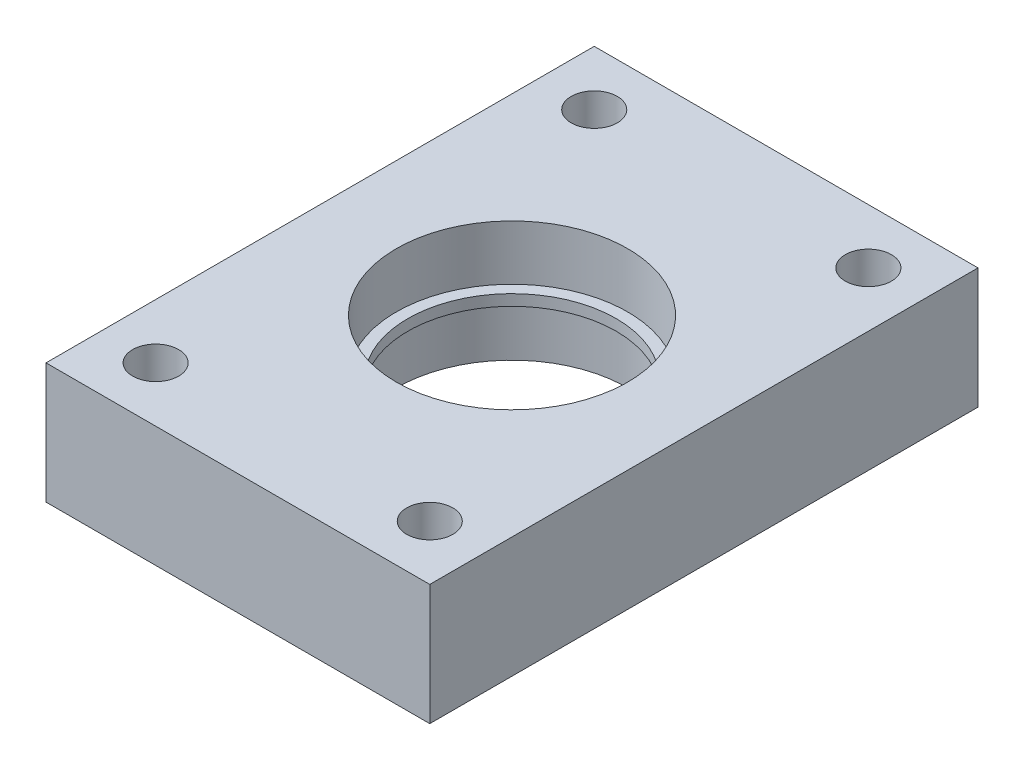
ISO-10303-21;
HEADER;
FILE_DESCRIPTION(('STEP AP214'),'2;1');
FILE_NAME('part.step','',(''),(''),'','','');
FILE_SCHEMA(('AUTOMOTIVE_DESIGN { 1 0 10303 214 1 1 1 1 }'));
ENDSEC;
DATA;
#1=APPLICATION_CONTEXT('core data for automotive mechanical design processes');
#2=APPLICATION_PROTOCOL_DEFINITION('international standard','automotive_design',2000,#1);
#3=PRODUCT_CONTEXT('',#1,'mechanical');
#4=PRODUCT('Part','Part','',(#3));
#5=PRODUCT_RELATED_PRODUCT_CATEGORY('part','',(#4));
#6=PRODUCT_DEFINITION_FORMATION('','',#4);
#7=PRODUCT_DEFINITION_CONTEXT('part definition',#1,'design');
#8=PRODUCT_DEFINITION('design','',#6,#7);
#9=PRODUCT_DEFINITION_SHAPE('','',#8);
#10=(LENGTH_UNIT() NAMED_UNIT(*) SI_UNIT(.MILLI.,.METRE.));
#11=(NAMED_UNIT(*) PLANE_ANGLE_UNIT() SI_UNIT($,.RADIAN.));
#12=(NAMED_UNIT(*) SI_UNIT($,.STERADIAN.) SOLID_ANGLE_UNIT());
#13=UNCERTAINTY_MEASURE_WITH_UNIT(LENGTH_MEASURE(1.E-05),#10,'distance_accuracy_value','');
#14=(GEOMETRIC_REPRESENTATION_CONTEXT(3) GLOBAL_UNCERTAINTY_ASSIGNED_CONTEXT((#13)) GLOBAL_UNIT_ASSIGNED_CONTEXT((#10,
#11,#12)) REPRESENTATION_CONTEXT('',''));
#15=CARTESIAN_POINT('',(0.,0.,0.));
#16=DIRECTION('',(0.,0.,1.));
#17=DIRECTION('',(1.,0.,0.));
#18=AXIS2_PLACEMENT_3D('',#15,#16,#17);
#19=CARTESIAN_POINT('',(-12.5,20.,20.));
#20=DIRECTION('',(0.,-1.,0.));
#21=DIRECTION('',(0.,0.,-1.));
#22=AXIS2_PLACEMENT_3D('',#19,#20,#21);
#23=CYLINDRICAL_SURFACE('',#22,2.1);
#24=CARTESIAN_POINT('',(-12.5,11.,20.));
#25=DIRECTION('',(0.,1.,0.));
#26=DIRECTION('',(0.,0.,1.));
#27=AXIS2_PLACEMENT_3D('',#24,#25,#26);
#28=CIRCLE('',#27,2.1);
#29=CARTESIAN_POINT('',(-12.5,11.,22.1));
#30=VERTEX_POINT('',#29);
#31=EDGE_CURVE('E113',#30,#30,#28,.T.);
#32=ORIENTED_EDGE('',*,*,#31,.T.);
#33=EDGE_LOOP('',(#32));
#34=FACE_BOUND('',#33,.T.);
#35=CARTESIAN_POINT('',(-12.5,2.2,20.));
#36=DIRECTION('',(0.,-1.,0.));
#37=DIRECTION('',(0.,0.,-1.));
#38=AXIS2_PLACEMENT_3D('',#35,#36,#37);
#39=CIRCLE('',#38,2.1);
#40=CARTESIAN_POINT('',(-12.5,2.2,17.9));
#41=VERTEX_POINT('',#40);
#42=EDGE_CURVE('E39',#41,#41,#39,.F.);
#43=ORIENTED_EDGE('',*,*,#42,.F.);
#44=EDGE_LOOP('',(#43));
#45=FACE_BOUND('',#44,.T.);
#46=ADVANCED_FACE('F35',(#34,#45),#23,.F.);
#47=CARTESIAN_POINT('',(12.5,20.,-20.));
#48=DIRECTION('',(0.,-1.,0.));
#49=DIRECTION('',(0.,0.,-1.));
#50=AXIS2_PLACEMENT_3D('',#47,#48,#49);
#51=CYLINDRICAL_SURFACE('',#50,2.1);
#52=CARTESIAN_POINT('',(12.5,11.,-20.));
#53=DIRECTION('',(0.,1.,0.));
#54=DIRECTION('',(0.,0.,1.));
#55=AXIS2_PLACEMENT_3D('',#52,#53,#54);
#56=CIRCLE('',#55,2.1);
#57=CARTESIAN_POINT('',(12.5,11.,-17.9));
#58=VERTEX_POINT('',#57);
#59=EDGE_CURVE('E119',#58,#58,#56,.T.);
#60=ORIENTED_EDGE('',*,*,#59,.T.);
#61=EDGE_LOOP('',(#60));
#62=FACE_BOUND('',#61,.T.);
#63=CARTESIAN_POINT('',(12.5,2.2,-20.));
#64=DIRECTION('',(0.,-1.,0.));
#65=DIRECTION('',(0.,0.,-1.));
#66=AXIS2_PLACEMENT_3D('',#63,#64,#65);
#67=CIRCLE('',#66,2.1);
#68=CARTESIAN_POINT('',(12.5,2.2,-22.1));
#69=VERTEX_POINT('',#68);
#70=EDGE_CURVE('E129',#69,#69,#67,.F.);
#71=ORIENTED_EDGE('',*,*,#70,.F.);
#72=EDGE_LOOP('',(#71));
#73=FACE_BOUND('',#72,.T.);
#74=ADVANCED_FACE('F142',(#62,#73),#51,.F.);
#75=CARTESIAN_POINT('',(0.,0.,0.));
#76=DIRECTION('',(0.,1.,0.));
#77=DIRECTION('',(0.,0.,1.));
#78=AXIS2_PLACEMENT_3D('',#75,#76,#77);
#79=PLANE('',#78);
#80=CARTESIAN_POINT('',(-12.5,0.,-20.));
#81=DIRECTION('',(0.,-1.,0.));
#82=DIRECTION('',(0.,0.,1.));
#83=AXIS2_PLACEMENT_3D('',#80,#81,#82);
#84=CIRCLE('',#83,3.8);
#85=CARTESIAN_POINT('',(-12.5,0.,-16.2));
#86=VERTEX_POINT('',#85);
#87=EDGE_CURVE('E228',#86,#86,#84,.T.);
#88=ORIENTED_EDGE('',*,*,#87,.F.);
#89=EDGE_LOOP('',(#88));
#90=FACE_BOUND('',#89,.T.);
#91=CARTESIAN_POINT('',(12.5,0.,-20.));
#92=DIRECTION('',(0.,-1.,0.));
#93=DIRECTION('',(0.,0.,-1.));
#94=AXIS2_PLACEMENT_3D('',#91,#92,#93);
#95=CIRCLE('',#94,3.80000000000016);
#96=CARTESIAN_POINT('',(12.5,0.,-23.8000000000002));
#97=VERTEX_POINT('',#96);
#98=EDGE_CURVE('E234',#97,#97,#95,.T.);
#99=ORIENTED_EDGE('',*,*,#98,.F.);
#100=EDGE_LOOP('',(#99));
#101=FACE_BOUND('',#100,.T.);
#102=CARTESIAN_POINT('',(12.5,0.,20.));
#103=DIRECTION('',(0.,-1.,0.));
#104=DIRECTION('',(0.,0.,1.));
#105=AXIS2_PLACEMENT_3D('',#102,#103,#104);
#106=CIRCLE('',#105,3.80000000000016);
#107=CARTESIAN_POINT('',(12.5,0.,23.8000000000002));
#108=VERTEX_POINT('',#107);
#109=EDGE_CURVE('E240',#108,#108,#106,.T.);
#110=ORIENTED_EDGE('',*,*,#109,.F.);
#111=EDGE_LOOP('',(#110));
#112=FACE_BOUND('',#111,.T.);
#113=CARTESIAN_POINT('',(-12.5,0.,20.));
#114=DIRECTION('',(0.,-1.,0.));
#115=DIRECTION('',(0.,0.,-1.));
#116=AXIS2_PLACEMENT_3D('',#113,#114,#115);
#117=CIRCLE('',#116,3.8);
#118=CARTESIAN_POINT('',(-12.5,0.,16.2));
#119=VERTEX_POINT('',#118);
#120=EDGE_CURVE('E222',#119,#119,#117,.T.);
#121=ORIENTED_EDGE('',*,*,#120,.F.);
#122=EDGE_LOOP('',(#121));
#123=FACE_BOUND('',#122,.T.);
#124=CARTESIAN_POINT('',(0.,0.,0.));
#125=DIRECTION('',(0.,1.,0.));
#126=DIRECTION('',(0.,0.,1.));
#127=AXIS2_PLACEMENT_3D('',#124,#125,#126);
#128=CIRCLE('',#127,10.55);
#129=CARTESIAN_POINT('',(0.,0.,10.55));
#130=VERTEX_POINT('',#129);
#131=EDGE_CURVE('E208',#130,#130,#128,.T.);
#132=ORIENTED_EDGE('',*,*,#131,.T.);
#133=EDGE_LOOP('',(#132));
#134=FACE_BOUND('',#133,.T.);
#135=DIRECTION('',(0.,0.,-1.));
#136=VECTOR('',#135,1.);
#137=CARTESIAN_POINT('',(17.5,0.,0.));
#138=LINE('',#137,#136);
#139=CARTESIAN_POINT('',(17.5,0.,25.));
#140=VERTEX_POINT('',#139);
#141=CARTESIAN_POINT('',(17.5,0.,-25.));
#142=VERTEX_POINT('',#141);
#143=EDGE_CURVE('E72',#140,#142,#138,.T.);
#144=ORIENTED_EDGE('',*,*,#143,.F.);
#145=DIRECTION('',(1.,0.,0.));
#146=VECTOR('',#145,1.);
#147=CARTESIAN_POINT('',(-17.5,0.,25.));
#148=LINE('',#147,#146);
#149=CARTESIAN_POINT('',(-17.5,0.,25.));
#150=VERTEX_POINT('',#149);
#151=EDGE_CURVE('E125',#150,#140,#148,.T.);
#152=ORIENTED_EDGE('',*,*,#151,.F.);
#153=DIRECTION('',(0.,0.,1.));
#154=VECTOR('',#153,1.);
#155=CARTESIAN_POINT('',(-17.5,0.,0.));
#156=LINE('',#155,#154);
#157=CARTESIAN_POINT('',(-17.5,0.,-25.));
#158=VERTEX_POINT('',#157);
#159=EDGE_CURVE('E66',#158,#150,#156,.T.);
#160=ORIENTED_EDGE('',*,*,#159,.F.);
#161=DIRECTION('',(-1.,0.,0.));
#162=VECTOR('',#161,1.);
#163=CARTESIAN_POINT('',(17.5,0.,-25.));
#164=LINE('',#163,#162);
#165=EDGE_CURVE('E101',#142,#158,#164,.T.);
#166=ORIENTED_EDGE('',*,*,#165,.F.);
#167=EDGE_LOOP('',(#144,#152,#160,#166));
#168=FACE_BOUND('',#167,.T.);
#169=ADVANCED_FACE('F149',(#90,#101,#112,#123,#134,#168),#79,.F.);
#170=CARTESIAN_POINT('',(0.,11.,0.));
#171=DIRECTION('',(0.,-1.,0.));
#172=DIRECTION('',(0.,0.,-1.));
#173=AXIS2_PLACEMENT_3D('',#170,#171,#172);
#174=CYLINDRICAL_SURFACE('',#173,9.5);
#175=CARTESIAN_POINT('',(0.,6.,0.));
#176=DIRECTION('',(0.,1.,0.));
#177=DIRECTION('',(0.,0.,1.));
#178=AXIS2_PLACEMENT_3D('',#175,#176,#177);
#179=CIRCLE('',#178,9.5);
#180=CARTESIAN_POINT('',(0.,6.,9.5));
#181=VERTEX_POINT('',#180);
#182=EDGE_CURVE('E104',#181,#181,#179,.T.);
#183=ORIENTED_EDGE('',*,*,#182,.T.);
#184=EDGE_LOOP('',(#183));
#185=FACE_BOUND('',#184,.T.);
#186=CARTESIAN_POINT('',(0.,5.,0.));
#187=DIRECTION('',(0.,-1.,0.));
#188=DIRECTION('',(0.,0.,-1.));
#189=AXIS2_PLACEMENT_3D('',#186,#187,#188);
#190=CIRCLE('',#189,9.5);
#191=CARTESIAN_POINT('',(0.,5.,-9.5));
#192=VERTEX_POINT('',#191);
#193=EDGE_CURVE('E199',#192,#192,#190,.T.);
#194=ORIENTED_EDGE('',*,*,#193,.T.);
#195=EDGE_LOOP('',(#194));
#196=FACE_BOUND('',#195,.T.);
#197=ADVANCED_FACE('F172',(#185,#196),#174,.F.);
#198=CARTESIAN_POINT('',(0.,11.,0.));
#199=DIRECTION('',(0.,1.,0.));
#200=DIRECTION('',(0.,0.,1.));
#201=AXIS2_PLACEMENT_3D('',#198,#199,#200);
#202=PLANE('',#201);
#203=CARTESIAN_POINT('',(-12.5,11.,-20.));
#204=DIRECTION('',(0.,1.,0.));
#205=DIRECTION('',(0.,0.,1.));
#206=AXIS2_PLACEMENT_3D('',#203,#204,#205);
#207=CIRCLE('',#206,2.1);
#208=CARTESIAN_POINT('',(-12.5,11.,-17.9));
#209=VERTEX_POINT('',#208);
#210=EDGE_CURVE('E122',#209,#209,#207,.T.);
#211=ORIENTED_EDGE('',*,*,#210,.F.);
#212=EDGE_LOOP('',(#211));
#213=FACE_BOUND('',#212,.T.);
#214=ORIENTED_EDGE('',*,*,#59,.F.);
#215=EDGE_LOOP('',(#214));
#216=FACE_BOUND('',#215,.T.);
#217=CARTESIAN_POINT('',(12.5,11.,20.));
#218=DIRECTION('',(0.,1.,0.));
#219=DIRECTION('',(0.,0.,1.));
#220=AXIS2_PLACEMENT_3D('',#217,#218,#219);
#221=CIRCLE('',#220,2.1);
#222=CARTESIAN_POINT('',(12.5,11.,22.1));
#223=VERTEX_POINT('',#222);
#224=EDGE_CURVE('E116',#223,#223,#221,.T.);
#225=ORIENTED_EDGE('',*,*,#224,.F.);
#226=EDGE_LOOP('',(#225));
#227=FACE_BOUND('',#226,.T.);
#228=ORIENTED_EDGE('',*,*,#31,.F.);
#229=EDGE_LOOP('',(#228));
#230=FACE_BOUND('',#229,.T.);
#231=CARTESIAN_POINT('',(0.,11.,0.));
#232=DIRECTION('',(0.,1.,0.));
#233=DIRECTION('',(0.,0.,1.));
#234=AXIS2_PLACEMENT_3D('',#231,#232,#233);
#235=CIRCLE('',#234,10.55);
#236=CARTESIAN_POINT('',(0.,11.,10.55));
#237=VERTEX_POINT('',#236);
#238=EDGE_CURVE('E201',#237,#237,#235,.T.);
#239=ORIENTED_EDGE('',*,*,#238,.F.);
#240=EDGE_LOOP('',(#239));
#241=FACE_BOUND('',#240,.T.);
#242=DIRECTION('',(-1.,0.,0.));
#243=VECTOR('',#242,1.);
#244=CARTESIAN_POINT('',(17.5,11.,-25.));
#245=LINE('',#244,#243);
#246=CARTESIAN_POINT('',(17.5,11.,-25.));
#247=VERTEX_POINT('',#246);
#248=CARTESIAN_POINT('',(-17.5,11.,-25.));
#249=VERTEX_POINT('',#248);
#250=EDGE_CURVE('E85',#247,#249,#245,.T.);
#251=ORIENTED_EDGE('',*,*,#250,.T.);
#252=DIRECTION('',(0.,0.,1.));
#253=VECTOR('',#252,1.);
#254=CARTESIAN_POINT('',(-17.5,11.,-25.));
#255=LINE('',#254,#253);
#256=CARTESIAN_POINT('',(-17.5,11.,25.));
#257=VERTEX_POINT('',#256);
#258=EDGE_CURVE('E78',#249,#257,#255,.T.);
#259=ORIENTED_EDGE('',*,*,#258,.T.);
#260=DIRECTION('',(1.,0.,0.));
#261=VECTOR('',#260,1.);
#262=CARTESIAN_POINT('',(-17.5,11.,25.));
#263=LINE('',#262,#261);
#264=CARTESIAN_POINT('',(17.5,11.,25.));
#265=VERTEX_POINT('',#264);
#266=EDGE_CURVE('E82',#257,#265,#263,.T.);
#267=ORIENTED_EDGE('',*,*,#266,.T.);
#268=DIRECTION('',(0.,0.,-1.));
#269=VECTOR('',#268,1.);
#270=CARTESIAN_POINT('',(17.5,11.,0.));
#271=LINE('',#270,#269);
#272=EDGE_CURVE('E54',#265,#247,#271,.T.);
#273=ORIENTED_EDGE('',*,*,#272,.T.);
#274=EDGE_LOOP('',(#251,#259,#267,#273));
#275=FACE_BOUND('',#274,.T.);
#276=ADVANCED_FACE('F80',(#213,#216,#227,#230,#241,#275),#202,.T.);
#277=CARTESIAN_POINT('',(17.5,11.,-25.));
#278=DIRECTION('',(0.,0.,1.));
#279=DIRECTION('',(1.,0.,0.));
#280=AXIS2_PLACEMENT_3D('',#277,#278,#279);
#281=PLANE('',#280);
#282=ORIENTED_EDGE('',*,*,#165,.T.);
#283=DIRECTION('',(0.,-1.,0.));
#284=VECTOR('',#283,1.);
#285=CARTESIAN_POINT('',(-17.5,11.,-25.));
#286=LINE('',#285,#284);
#287=EDGE_CURVE('E11',#249,#158,#286,.T.);
#288=ORIENTED_EDGE('',*,*,#287,.F.);
#289=ORIENTED_EDGE('',*,*,#250,.F.);
#290=DIRECTION('',(0.,-1.,0.));
#291=VECTOR('',#290,1.);
#292=CARTESIAN_POINT('',(17.5,11.,-25.));
#293=LINE('',#292,#291);
#294=EDGE_CURVE('E97',#247,#142,#293,.T.);
#295=ORIENTED_EDGE('',*,*,#294,.T.);
#296=EDGE_LOOP('',(#282,#288,#289,#295));
#297=FACE_BOUND('',#296,.T.);
#298=ADVANCED_FACE('F37',(#297),#281,.F.);
#299=CARTESIAN_POINT('',(-17.5,11.,0.));
#300=DIRECTION('',(1.,0.,0.));
#301=DIRECTION('',(0.,0.,-1.));
#302=AXIS2_PLACEMENT_3D('',#299,#300,#301);
#303=PLANE('',#302);
#304=ORIENTED_EDGE('',*,*,#159,.T.);
#305=DIRECTION('',(0.,-1.,0.));
#306=VECTOR('',#305,1.);
#307=CARTESIAN_POINT('',(-17.5,11.,25.));
#308=LINE('',#307,#306);
#309=EDGE_CURVE('E45',#257,#150,#308,.T.);
#310=ORIENTED_EDGE('',*,*,#309,.F.);
#311=ORIENTED_EDGE('',*,*,#258,.F.);
#312=ORIENTED_EDGE('',*,*,#287,.T.);
#313=EDGE_LOOP('',(#304,#310,#311,#312));
#314=FACE_BOUND('',#313,.T.);
#315=ADVANCED_FACE('F90',(#314),#303,.F.);
#316=CARTESIAN_POINT('',(-17.5,11.,25.));
#317=DIRECTION('',(0.,0.,-1.));
#318=DIRECTION('',(-1.,0.,0.));
#319=AXIS2_PLACEMENT_3D('',#316,#317,#318);
#320=PLANE('',#319);
#321=ORIENTED_EDGE('',*,*,#309,.T.);
#322=ORIENTED_EDGE('',*,*,#151,.T.);
#323=DIRECTION('',(0.,-1.,0.));
#324=VECTOR('',#323,1.);
#325=CARTESIAN_POINT('',(17.5,11.,25.));
#326=LINE('',#325,#324);
#327=EDGE_CURVE('E92',#265,#140,#326,.T.);
#328=ORIENTED_EDGE('',*,*,#327,.F.);
#329=ORIENTED_EDGE('',*,*,#266,.F.);
#330=EDGE_LOOP('',(#321,#322,#328,#329));
#331=FACE_BOUND('',#330,.T.);
#332=ADVANCED_FACE('F94',(#331),#320,.F.);
#333=CARTESIAN_POINT('',(17.5,11.,0.));
#334=DIRECTION('',(-1.,0.,0.));
#335=DIRECTION('',(0.,0.,1.));
#336=AXIS2_PLACEMENT_3D('',#333,#334,#335);
#337=PLANE('',#336);
#338=ORIENTED_EDGE('',*,*,#327,.T.);
#339=ORIENTED_EDGE('',*,*,#143,.T.);
#340=ORIENTED_EDGE('',*,*,#294,.F.);
#341=ORIENTED_EDGE('',*,*,#272,.F.);
#342=EDGE_LOOP('',(#338,#339,#340,#341));
#343=FACE_BOUND('',#342,.T.);
#344=ADVANCED_FACE('F170',(#343),#337,.F.);
#345=CARTESIAN_POINT('',(0.,6.,0.));
#346=DIRECTION('',(0.,1.,0.));
#347=DIRECTION('',(0.,0.,1.));
#348=AXIS2_PLACEMENT_3D('',#345,#346,#347);
#349=CYLINDRICAL_SURFACE('',#348,10.55);
#350=CARTESIAN_POINT('',(0.,6.,0.));
#351=DIRECTION('',(0.,1.,0.));
#352=DIRECTION('',(0.,0.,1.));
#353=AXIS2_PLACEMENT_3D('',#350,#351,#352);
#354=CIRCLE('',#353,10.55);
#355=CARTESIAN_POINT('',(0.,6.,10.55));
#356=VERTEX_POINT('',#355);
#357=EDGE_CURVE('E198',#356,#356,#354,.T.);
#358=ORIENTED_EDGE('',*,*,#357,.F.);
#359=EDGE_LOOP('',(#358));
#360=FACE_BOUND('',#359,.T.);
#361=ORIENTED_EDGE('',*,*,#238,.T.);
#362=EDGE_LOOP('',(#361));
#363=FACE_BOUND('',#362,.T.);
#364=ADVANCED_FACE('F166',(#360,#363),#349,.F.);
#365=CARTESIAN_POINT('',(0.,6.,0.));
#366=DIRECTION('',(0.,1.,0.));
#367=DIRECTION('',(0.,0.,1.));
#368=AXIS2_PLACEMENT_3D('',#365,#366,#367);
#369=PLANE('',#368);
#370=ORIENTED_EDGE('',*,*,#182,.F.);
#371=EDGE_LOOP('',(#370));
#372=FACE_BOUND('',#371,.T.);
#373=ORIENTED_EDGE('',*,*,#357,.T.);
#374=EDGE_LOOP('',(#373));
#375=FACE_BOUND('',#374,.T.);
#376=ADVANCED_FACE('F162',(#372,#375),#369,.T.);
#377=CARTESIAN_POINT('',(0.,5.,0.));
#378=DIRECTION('',(0.,-1.,0.));
#379=DIRECTION('',(0.,0.,-1.));
#380=AXIS2_PLACEMENT_3D('',#377,#378,#379);
#381=CYLINDRICAL_SURFACE('',#380,10.55);
#382=CARTESIAN_POINT('',(0.,5.,0.));
#383=DIRECTION('',(0.,1.,0.));
#384=DIRECTION('',(0.,0.,1.));
#385=AXIS2_PLACEMENT_3D('',#382,#383,#384);
#386=CIRCLE('',#385,10.55);
#387=CARTESIAN_POINT('',(0.,5.,10.55));
#388=VERTEX_POINT('',#387);
#389=EDGE_CURVE('E202',#388,#388,#386,.T.);
#390=ORIENTED_EDGE('',*,*,#389,.T.);
#391=EDGE_LOOP('',(#390));
#392=FACE_BOUND('',#391,.T.);
#393=ORIENTED_EDGE('',*,*,#131,.F.);
#394=EDGE_LOOP('',(#393));
#395=FACE_BOUND('',#394,.T.);
#396=ADVANCED_FACE('F158',(#392,#395),#381,.F.);
#397=CARTESIAN_POINT('',(0.,5.,0.));
#398=DIRECTION('',(0.,-1.,0.));
#399=DIRECTION('',(0.,0.,1.));
#400=AXIS2_PLACEMENT_3D('',#397,#398,#399);
#401=PLANE('',#400);
#402=ORIENTED_EDGE('',*,*,#193,.F.);
#403=EDGE_LOOP('',(#402));
#404=FACE_BOUND('',#403,.T.);
#405=ORIENTED_EDGE('',*,*,#389,.F.);
#406=EDGE_LOOP('',(#405));
#407=FACE_BOUND('',#406,.T.);
#408=ADVANCED_FACE('F155',(#404,#407),#401,.T.);
#409=CARTESIAN_POINT('',(12.5,20.,20.));
#410=DIRECTION('',(0.,-1.,0.));
#411=DIRECTION('',(0.,0.,-1.));
#412=AXIS2_PLACEMENT_3D('',#409,#410,#411);
#413=CYLINDRICAL_SURFACE('',#412,2.1);
#414=CARTESIAN_POINT('',(12.5,2.2,20.));
#415=DIRECTION('',(0.,1.,0.));
#416=DIRECTION('',(0.,0.,1.));
#417=AXIS2_PLACEMENT_3D('',#414,#415,#416);
#418=CIRCLE('',#417,2.1);
#419=CARTESIAN_POINT('',(12.5,2.2,22.1));
#420=VERTEX_POINT('',#419);
#421=EDGE_CURVE('E132',#420,#420,#418,.F.);
#422=ORIENTED_EDGE('',*,*,#421,.T.);
#423=EDGE_LOOP('',(#422));
#424=FACE_BOUND('',#423,.T.);
#425=ORIENTED_EDGE('',*,*,#224,.T.);
#426=EDGE_LOOP('',(#425));
#427=FACE_BOUND('',#426,.T.);
#428=ADVANCED_FACE('F157',(#424,#427),#413,.F.);
#429=CARTESIAN_POINT('',(-12.5,20.,-20.));
#430=DIRECTION('',(0.,-1.,0.));
#431=DIRECTION('',(0.,0.,-1.));
#432=AXIS2_PLACEMENT_3D('',#429,#430,#431);
#433=CYLINDRICAL_SURFACE('',#432,2.1);
#434=CARTESIAN_POINT('',(-12.5,2.2,-20.));
#435=DIRECTION('',(0.,1.,0.));
#436=DIRECTION('',(0.,0.,1.));
#437=AXIS2_PLACEMENT_3D('',#434,#435,#436);
#438=CIRCLE('',#437,2.1);
#439=CARTESIAN_POINT('',(-12.5,2.2,-17.9));
#440=VERTEX_POINT('',#439);
#441=EDGE_CURVE('E126',#440,#440,#438,.F.);
#442=ORIENTED_EDGE('',*,*,#441,.T.);
#443=EDGE_LOOP('',(#442));
#444=FACE_BOUND('',#443,.T.);
#445=ORIENTED_EDGE('',*,*,#210,.T.);
#446=EDGE_LOOP('',(#445));
#447=FACE_BOUND('',#446,.T.);
#448=ADVANCED_FACE('F154',(#444,#447),#433,.F.);
#449=CARTESIAN_POINT('',(-12.5,2.2,-20.));
#450=DIRECTION('',(0.,1.,0.));
#451=DIRECTION('',(0.,0.,1.));
#452=AXIS2_PLACEMENT_3D('',#449,#450,#451);
#453=PLANE('',#452);
#454=CARTESIAN_POINT('',(-12.5,2.2,-20.));
#455=DIRECTION('',(0.,-1.,0.));
#456=DIRECTION('',(0.,0.,1.));
#457=AXIS2_PLACEMENT_3D('',#454,#455,#456);
#458=CIRCLE('',#457,3.8);
#459=CARTESIAN_POINT('',(-12.5,2.2,-16.2));
#460=VERTEX_POINT('',#459);
#461=EDGE_CURVE('E231',#460,#460,#458,.T.);
#462=ORIENTED_EDGE('',*,*,#461,.T.);
#463=EDGE_LOOP('',(#462));
#464=FACE_BOUND('',#463,.T.);
#465=ORIENTED_EDGE('',*,*,#441,.F.);
#466=EDGE_LOOP('',(#465));
#467=FACE_BOUND('',#466,.T.);
#468=ADVANCED_FACE('F277',(#464,#467),#453,.F.);
#469=CARTESIAN_POINT('',(-12.5,2.2,-20.));
#470=DIRECTION('',(0.,-1.,0.));
#471=DIRECTION('',(0.,0.,-1.));
#472=AXIS2_PLACEMENT_3D('',#469,#470,#471);
#473=CYLINDRICAL_SURFACE('',#472,3.8);
#474=ORIENTED_EDGE('',*,*,#461,.F.);
#475=EDGE_LOOP('',(#474));
#476=FACE_BOUND('',#475,.T.);
#477=ORIENTED_EDGE('',*,*,#87,.T.);
#478=EDGE_LOOP('',(#477));
#479=FACE_BOUND('',#478,.T.);
#480=ADVANCED_FACE('F287',(#476,#479),#473,.F.);
#481=CARTESIAN_POINT('',(12.5,2.2,-20.));
#482=DIRECTION('',(0.,-1.,0.));
#483=DIRECTION('',(0.,0.,-1.));
#484=AXIS2_PLACEMENT_3D('',#481,#482,#483);
#485=PLANE('',#484);
#486=CARTESIAN_POINT('',(12.5,2.2,-20.));
#487=DIRECTION('',(0.,-1.,0.));
#488=DIRECTION('',(0.,0.,-1.));
#489=AXIS2_PLACEMENT_3D('',#486,#487,#488);
#490=CIRCLE('',#489,3.80000000000016);
#491=CARTESIAN_POINT('',(12.5,2.2,-23.8000000000002));
#492=VERTEX_POINT('',#491);
#493=EDGE_CURVE('E237',#492,#492,#490,.T.);
#494=ORIENTED_EDGE('',*,*,#493,.T.);
#495=EDGE_LOOP('',(#494));
#496=FACE_BOUND('',#495,.T.);
#497=ORIENTED_EDGE('',*,*,#70,.T.);
#498=EDGE_LOOP('',(#497));
#499=FACE_BOUND('',#498,.T.);
#500=ADVANCED_FACE('F298',(#496,#499),#485,.T.);
#501=CARTESIAN_POINT('',(12.5,2.2,-20.));
#502=DIRECTION('',(0.,-1.,0.));
#503=DIRECTION('',(0.,0.,-1.));
#504=AXIS2_PLACEMENT_3D('',#501,#502,#503);
#505=CYLINDRICAL_SURFACE('',#504,3.80000000000016);
#506=ORIENTED_EDGE('',*,*,#493,.F.);
#507=EDGE_LOOP('',(#506));
#508=FACE_BOUND('',#507,.T.);
#509=ORIENTED_EDGE('',*,*,#98,.T.);
#510=EDGE_LOOP('',(#509));
#511=FACE_BOUND('',#510,.T.);
#512=ADVANCED_FACE('F300',(#508,#511),#505,.F.);
#513=CARTESIAN_POINT('',(12.5,2.2,20.));
#514=DIRECTION('',(0.,1.,0.));
#515=DIRECTION('',(0.,0.,1.));
#516=AXIS2_PLACEMENT_3D('',#513,#514,#515);
#517=PLANE('',#516);
#518=CARTESIAN_POINT('',(12.5,2.2,20.));
#519=DIRECTION('',(0.,-1.,0.));
#520=DIRECTION('',(0.,0.,1.));
#521=AXIS2_PLACEMENT_3D('',#518,#519,#520);
#522=CIRCLE('',#521,3.80000000000016);
#523=CARTESIAN_POINT('',(12.5,2.2,23.8000000000002));
#524=VERTEX_POINT('',#523);
#525=EDGE_CURVE('E225',#524,#524,#522,.T.);
#526=ORIENTED_EDGE('',*,*,#525,.T.);
#527=EDGE_LOOP('',(#526));
#528=FACE_BOUND('',#527,.T.);
#529=ORIENTED_EDGE('',*,*,#421,.F.);
#530=EDGE_LOOP('',(#529));
#531=FACE_BOUND('',#530,.T.);
#532=ADVANCED_FACE('F246',(#528,#531),#517,.F.);
#533=CARTESIAN_POINT('',(12.5,2.2,20.));
#534=DIRECTION('',(0.,-1.,0.));
#535=DIRECTION('',(0.,0.,-1.));
#536=AXIS2_PLACEMENT_3D('',#533,#534,#535);
#537=CYLINDRICAL_SURFACE('',#536,3.80000000000016);
#538=ORIENTED_EDGE('',*,*,#525,.F.);
#539=EDGE_LOOP('',(#538));
#540=FACE_BOUND('',#539,.T.);
#541=ORIENTED_EDGE('',*,*,#109,.T.);
#542=EDGE_LOOP('',(#541));
#543=FACE_BOUND('',#542,.T.);
#544=ADVANCED_FACE('F249',(#540,#543),#537,.F.);
#545=CARTESIAN_POINT('',(-12.5,2.2,20.));
#546=DIRECTION('',(0.,-1.,0.));
#547=DIRECTION('',(0.,0.,-1.));
#548=AXIS2_PLACEMENT_3D('',#545,#546,#547);
#549=PLANE('',#548);
#550=CARTESIAN_POINT('',(-12.5,2.2,20.));
#551=DIRECTION('',(0.,-1.,0.));
#552=DIRECTION('',(0.,0.,-1.));
#553=AXIS2_PLACEMENT_3D('',#550,#551,#552);
#554=CIRCLE('',#553,3.8);
#555=CARTESIAN_POINT('',(-12.5,2.2,16.2));
#556=VERTEX_POINT('',#555);
#557=EDGE_CURVE('E130',#556,#556,#554,.T.);
#558=ORIENTED_EDGE('',*,*,#557,.T.);
#559=EDGE_LOOP('',(#558));
#560=FACE_BOUND('',#559,.T.);
#561=ORIENTED_EDGE('',*,*,#42,.T.);
#562=EDGE_LOOP('',(#561));
#563=FACE_BOUND('',#562,.T.);
#564=ADVANCED_FACE('F139',(#560,#563),#549,.T.);
#565=CARTESIAN_POINT('',(-12.5,2.2,20.));
#566=DIRECTION('',(0.,-1.,0.));
#567=DIRECTION('',(0.,0.,-1.));
#568=AXIS2_PLACEMENT_3D('',#565,#566,#567);
#569=CYLINDRICAL_SURFACE('',#568,3.8);
#570=ORIENTED_EDGE('',*,*,#557,.F.);
#571=EDGE_LOOP('',(#570));
#572=FACE_BOUND('',#571,.T.);
#573=ORIENTED_EDGE('',*,*,#120,.T.);
#574=EDGE_LOOP('',(#573));
#575=FACE_BOUND('',#574,.T.);
#576=ADVANCED_FACE('F261',(#572,#575),#569,.F.);
#577=CLOSED_SHELL('',(#46,#74,#169,#197,#276,#298,#315,#332,#344,#364,#376,#396,#408,#428,#448,
#468,#480,#500,#512,#532,#544,#564,#576));
#578=MANIFOLD_SOLID_BREP('B2',#577);
#579=ADVANCED_BREP_SHAPE_REPRESENTATION('',(#18,#578),#14);
#580=SHAPE_DEFINITION_REPRESENTATION(#9,#579);
ENDSEC;
END-ISO-10303-21;
